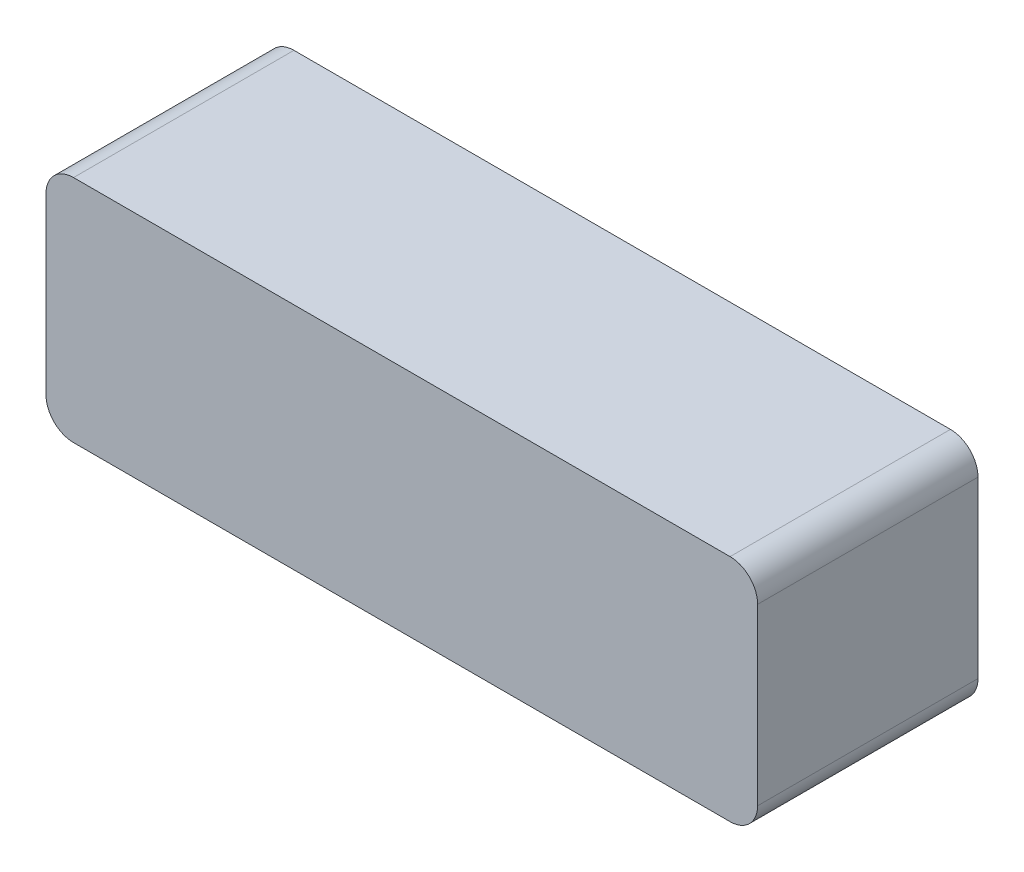
ISO-10303-21;
HEADER;
FILE_DESCRIPTION(('STEP AP214'),'2;1');
FILE_NAME('part.step','',(''),(''),'','','');
FILE_SCHEMA(('AUTOMOTIVE_DESIGN { 1 0 10303 214 1 1 1 1 }'));
ENDSEC;
DATA;
#1=APPLICATION_CONTEXT('core data for automotive mechanical design processes');
#2=APPLICATION_PROTOCOL_DEFINITION('international standard','automotive_design',2000,#1);
#3=PRODUCT_CONTEXT('',#1,'mechanical');
#4=PRODUCT('Part','Part','',(#3));
#5=PRODUCT_RELATED_PRODUCT_CATEGORY('part','',(#4));
#6=PRODUCT_DEFINITION_FORMATION('','',#4);
#7=PRODUCT_DEFINITION_CONTEXT('part definition',#1,'design');
#8=PRODUCT_DEFINITION('design','',#6,#7);
#9=PRODUCT_DEFINITION_SHAPE('','',#8);
#10=(LENGTH_UNIT() NAMED_UNIT(*) SI_UNIT(.MILLI.,.METRE.));
#11=(NAMED_UNIT(*) PLANE_ANGLE_UNIT() SI_UNIT($,.RADIAN.));
#12=(NAMED_UNIT(*) SI_UNIT($,.STERADIAN.) SOLID_ANGLE_UNIT());
#13=UNCERTAINTY_MEASURE_WITH_UNIT(LENGTH_MEASURE(1.E-05),#10,'distance_accuracy_value','');
#14=(GEOMETRIC_REPRESENTATION_CONTEXT(3) GLOBAL_UNCERTAINTY_ASSIGNED_CONTEXT((#13)) GLOBAL_UNIT_ASSIGNED_CONTEXT((#10,
#11,#12)) REPRESENTATION_CONTEXT('',''));
#15=CARTESIAN_POINT('',(0.,0.,0.));
#16=DIRECTION('',(0.,0.,1.));
#17=DIRECTION('',(1.,0.,0.));
#18=AXIS2_PLACEMENT_3D('',#15,#16,#17);
#19=CARTESIAN_POINT('',(-71.5,-19.,24.));
#20=DIRECTION('',(0.,0.,-1.));
#21=DIRECTION('',(-1.,0.,0.));
#22=AXIS2_PLACEMENT_3D('',#19,#20,#21);
#23=CYLINDRICAL_SURFACE('',#22,6.);
#24=CARTESIAN_POINT('',(-71.5,-19.,-24.));
#25=DIRECTION('',(0.,0.,1.));
#26=DIRECTION('',(1.,0.,0.));
#27=AXIS2_PLACEMENT_3D('',#24,#25,#26);
#28=CIRCLE('',#27,6.);
#29=CARTESIAN_POINT('',(-77.5,-19.,-24.));
#30=VERTEX_POINT('',#29);
#31=CARTESIAN_POINT('',(-71.5,-25.,-24.));
#32=VERTEX_POINT('',#31);
#33=EDGE_CURVE('E135',#30,#32,#28,.T.);
#34=ORIENTED_EDGE('',*,*,#33,.T.);
#35=DIRECTION('',(0.,0.,-1.));
#36=VECTOR('',#35,1.);
#37=CARTESIAN_POINT('',(-71.5,-25.,24.));
#38=LINE('',#37,#36);
#39=CARTESIAN_POINT('',(-71.5,-25.,24.));
#40=VERTEX_POINT('',#39);
#41=EDGE_CURVE('E11',#40,#32,#38,.T.);
#42=ORIENTED_EDGE('',*,*,#41,.F.);
#43=CARTESIAN_POINT('',(-71.5,-19.,24.));
#44=DIRECTION('',(0.,0.,1.));
#45=DIRECTION('',(1.,0.,0.));
#46=AXIS2_PLACEMENT_3D('',#43,#44,#45);
#47=CIRCLE('',#46,6.);
#48=CARTESIAN_POINT('',(-77.5,-19.,24.));
#49=VERTEX_POINT('',#48);
#50=EDGE_CURVE('E149',#49,#40,#47,.T.);
#51=ORIENTED_EDGE('',*,*,#50,.F.);
#52=DIRECTION('',(0.,0.,-1.));
#53=VECTOR('',#52,1.);
#54=CARTESIAN_POINT('',(-77.5,-19.,24.));
#55=LINE('',#54,#53);
#56=EDGE_CURVE('E131',#49,#30,#55,.T.);
#57=ORIENTED_EDGE('',*,*,#56,.T.);
#58=EDGE_LOOP('',(#34,#42,#51,#57));
#59=FACE_BOUND('',#58,.T.);
#60=ADVANCED_FACE('F39',(#59),#23,.T.);
#61=CARTESIAN_POINT('',(-71.5,-25.,24.));
#62=DIRECTION('',(0.,1.,0.));
#63=DIRECTION('',(0.,0.,1.));
#64=AXIS2_PLACEMENT_3D('',#61,#62,#63);
#65=PLANE('',#64);
#66=DIRECTION('',(1.,0.,0.));
#67=VECTOR('',#66,1.);
#68=CARTESIAN_POINT('',(-71.5,-25.,-24.));
#69=LINE('',#68,#67);
#70=CARTESIAN_POINT('',(71.5,-25.,-24.));
#71=VERTEX_POINT('',#70);
#72=EDGE_CURVE('E138',#32,#71,#69,.T.);
#73=ORIENTED_EDGE('',*,*,#72,.T.);
#74=DIRECTION('',(0.,0.,-1.));
#75=VECTOR('',#74,1.);
#76=CARTESIAN_POINT('',(71.5,-25.,24.));
#77=LINE('',#76,#75);
#78=CARTESIAN_POINT('',(71.5,-25.,24.));
#79=VERTEX_POINT('',#78);
#80=EDGE_CURVE('E47',#79,#71,#77,.T.);
#81=ORIENTED_EDGE('',*,*,#80,.F.);
#82=DIRECTION('',(1.,0.,0.));
#83=VECTOR('',#82,1.);
#84=CARTESIAN_POINT('',(-71.5,-25.,24.));
#85=LINE('',#84,#83);
#86=EDGE_CURVE('E98',#40,#79,#85,.T.);
#87=ORIENTED_EDGE('',*,*,#86,.F.);
#88=ORIENTED_EDGE('',*,*,#41,.T.);
#89=EDGE_LOOP('',(#73,#81,#87,#88));
#90=FACE_BOUND('',#89,.T.);
#91=ADVANCED_FACE('F184',(#90),#65,.F.);
#92=CARTESIAN_POINT('',(71.5,-19.,24.));
#93=DIRECTION('',(0.,0.,-1.));
#94=DIRECTION('',(-1.,0.,0.));
#95=AXIS2_PLACEMENT_3D('',#92,#93,#94);
#96=CYLINDRICAL_SURFACE('',#95,6.);
#97=CARTESIAN_POINT('',(71.5,-19.,-24.));
#98=DIRECTION('',(0.,0.,1.));
#99=DIRECTION('',(1.,0.,0.));
#100=AXIS2_PLACEMENT_3D('',#97,#98,#99);
#101=CIRCLE('',#100,6.);
#102=CARTESIAN_POINT('',(77.5,-19.,-24.));
#103=VERTEX_POINT('',#102);
#104=EDGE_CURVE('E140',#71,#103,#101,.T.);
#105=ORIENTED_EDGE('',*,*,#104,.T.);
#106=DIRECTION('',(0.,0.,-1.));
#107=VECTOR('',#106,1.);
#108=CARTESIAN_POINT('',(77.5,-19.,24.));
#109=LINE('',#108,#107);
#110=CARTESIAN_POINT('',(77.5,-19.,24.));
#111=VERTEX_POINT('',#110);
#112=EDGE_CURVE('E156',#111,#103,#109,.T.);
#113=ORIENTED_EDGE('',*,*,#112,.F.);
#114=CARTESIAN_POINT('',(71.5,-19.,24.));
#115=DIRECTION('',(0.,0.,1.));
#116=DIRECTION('',(1.,0.,0.));
#117=AXIS2_PLACEMENT_3D('',#114,#115,#116);
#118=CIRCLE('',#117,6.);
#119=EDGE_CURVE('E164',#79,#111,#118,.T.);
#120=ORIENTED_EDGE('',*,*,#119,.F.);
#121=ORIENTED_EDGE('',*,*,#80,.T.);
#122=EDGE_LOOP('',(#105,#113,#120,#121));
#123=FACE_BOUND('',#122,.T.);
#124=ADVANCED_FACE('F162',(#123),#96,.T.);
#125=CARTESIAN_POINT('',(77.5,-19.,24.));
#126=DIRECTION('',(-1.,0.,0.));
#127=DIRECTION('',(0.,0.,1.));
#128=AXIS2_PLACEMENT_3D('',#125,#126,#127);
#129=PLANE('',#128);
#130=DIRECTION('',(0.,1.,0.));
#131=VECTOR('',#130,1.);
#132=CARTESIAN_POINT('',(77.5,-19.,-24.));
#133=LINE('',#132,#131);
#134=CARTESIAN_POINT('',(77.5,19.,-24.));
#135=VERTEX_POINT('',#134);
#136=EDGE_CURVE('E142',#103,#135,#133,.T.);
#137=ORIENTED_EDGE('',*,*,#136,.T.);
#138=DIRECTION('',(0.,0.,-1.));
#139=VECTOR('',#138,1.);
#140=CARTESIAN_POINT('',(77.5,19.,24.));
#141=LINE('',#140,#139);
#142=CARTESIAN_POINT('',(77.5,19.,24.));
#143=VERTEX_POINT('',#142);
#144=EDGE_CURVE('E153',#143,#135,#141,.T.);
#145=ORIENTED_EDGE('',*,*,#144,.F.);
#146=DIRECTION('',(0.,1.,0.));
#147=VECTOR('',#146,1.);
#148=CARTESIAN_POINT('',(77.5,-19.,24.));
#149=LINE('',#148,#147);
#150=EDGE_CURVE('E176',#111,#143,#149,.T.);
#151=ORIENTED_EDGE('',*,*,#150,.F.);
#152=ORIENTED_EDGE('',*,*,#112,.T.);
#153=EDGE_LOOP('',(#137,#145,#151,#152));
#154=FACE_BOUND('',#153,.T.);
#155=ADVANCED_FACE('F172',(#154),#129,.F.);
#156=CARTESIAN_POINT('',(71.5,19.,24.));
#157=DIRECTION('',(0.,0.,-1.));
#158=DIRECTION('',(-1.,0.,0.));
#159=AXIS2_PLACEMENT_3D('',#156,#157,#158);
#160=CYLINDRICAL_SURFACE('',#159,6.);
#161=CARTESIAN_POINT('',(71.5,19.,-24.));
#162=DIRECTION('',(0.,0.,1.));
#163=DIRECTION('',(1.,0.,0.));
#164=AXIS2_PLACEMENT_3D('',#161,#162,#163);
#165=CIRCLE('',#164,6.);
#166=CARTESIAN_POINT('',(71.5,25.,-24.));
#167=VERTEX_POINT('',#166);
#168=EDGE_CURVE('E144',#135,#167,#165,.T.);
#169=ORIENTED_EDGE('',*,*,#168,.T.);
#170=DIRECTION('',(0.,0.,-1.));
#171=VECTOR('',#170,1.);
#172=CARTESIAN_POINT('',(71.5,25.,24.));
#173=LINE('',#172,#171);
#174=CARTESIAN_POINT('',(71.5,25.,24.));
#175=VERTEX_POINT('',#174);
#176=EDGE_CURVE('E126',#175,#167,#173,.T.);
#177=ORIENTED_EDGE('',*,*,#176,.F.);
#178=CARTESIAN_POINT('',(71.5,19.,24.));
#179=DIRECTION('',(0.,0.,1.));
#180=DIRECTION('',(1.,0.,0.));
#181=AXIS2_PLACEMENT_3D('',#178,#179,#180);
#182=CIRCLE('',#181,6.);
#183=EDGE_CURVE('E117',#143,#175,#182,.T.);
#184=ORIENTED_EDGE('',*,*,#183,.F.);
#185=ORIENTED_EDGE('',*,*,#144,.T.);
#186=EDGE_LOOP('',(#169,#177,#184,#185));
#187=FACE_BOUND('',#186,.T.);
#188=ADVANCED_FACE('F175',(#187),#160,.T.);
#189=CARTESIAN_POINT('',(71.5,25.,24.));
#190=DIRECTION('',(0.,-1.,0.));
#191=DIRECTION('',(0.,0.,-1.));
#192=AXIS2_PLACEMENT_3D('',#189,#190,#191);
#193=PLANE('',#192);
#194=DIRECTION('',(-1.,0.,0.));
#195=VECTOR('',#194,1.);
#196=CARTESIAN_POINT('',(71.5,25.,-24.));
#197=LINE('',#196,#195);
#198=CARTESIAN_POINT('',(-71.5,25.,-24.));
#199=VERTEX_POINT('',#198);
#200=EDGE_CURVE('E125',#167,#199,#197,.T.);
#201=ORIENTED_EDGE('',*,*,#200,.T.);
#202=DIRECTION('',(0.,0.,-1.));
#203=VECTOR('',#202,1.);
#204=CARTESIAN_POINT('',(-71.5,25.,24.));
#205=LINE('',#204,#203);
#206=CARTESIAN_POINT('',(-71.5,25.,24.));
#207=VERTEX_POINT('',#206);
#208=EDGE_CURVE('E122',#207,#199,#205,.T.);
#209=ORIENTED_EDGE('',*,*,#208,.F.);
#210=DIRECTION('',(-1.,0.,0.));
#211=VECTOR('',#210,1.);
#212=CARTESIAN_POINT('',(71.5,25.,24.));
#213=LINE('',#212,#211);
#214=EDGE_CURVE('E111',#175,#207,#213,.T.);
#215=ORIENTED_EDGE('',*,*,#214,.F.);
#216=ORIENTED_EDGE('',*,*,#176,.T.);
#217=EDGE_LOOP('',(#201,#209,#215,#216));
#218=FACE_BOUND('',#217,.T.);
#219=ADVANCED_FACE('F123',(#218),#193,.F.);
#220=CARTESIAN_POINT('',(-71.5,19.,24.));
#221=DIRECTION('',(0.,0.,-1.));
#222=DIRECTION('',(-1.,0.,0.));
#223=AXIS2_PLACEMENT_3D('',#220,#221,#222);
#224=CYLINDRICAL_SURFACE('',#223,6.);
#225=CARTESIAN_POINT('',(-71.5,19.,-24.));
#226=DIRECTION('',(0.,0.,1.));
#227=DIRECTION('',(1.,0.,0.));
#228=AXIS2_PLACEMENT_3D('',#225,#226,#227);
#229=CIRCLE('',#228,6.);
#230=CARTESIAN_POINT('',(-77.5,19.,-24.));
#231=VERTEX_POINT('',#230);
#232=EDGE_CURVE('E84',#199,#231,#229,.T.);
#233=ORIENTED_EDGE('',*,*,#232,.T.);
#234=DIRECTION('',(0.,0.,-1.));
#235=VECTOR('',#234,1.);
#236=CARTESIAN_POINT('',(-77.5,19.,24.));
#237=LINE('',#236,#235);
#238=CARTESIAN_POINT('',(-77.5,19.,24.));
#239=VERTEX_POINT('',#238);
#240=EDGE_CURVE('E127',#239,#231,#237,.T.);
#241=ORIENTED_EDGE('',*,*,#240,.F.);
#242=CARTESIAN_POINT('',(-71.5,19.,24.));
#243=DIRECTION('',(0.,0.,1.));
#244=DIRECTION('',(1.,0.,0.));
#245=AXIS2_PLACEMENT_3D('',#242,#243,#244);
#246=CIRCLE('',#245,6.);
#247=EDGE_CURVE('E115',#207,#239,#246,.T.);
#248=ORIENTED_EDGE('',*,*,#247,.F.);
#249=ORIENTED_EDGE('',*,*,#208,.T.);
#250=EDGE_LOOP('',(#233,#241,#248,#249));
#251=FACE_BOUND('',#250,.T.);
#252=ADVANCED_FACE('F129',(#251),#224,.T.);
#253=CARTESIAN_POINT('',(-77.5,19.,24.));
#254=DIRECTION('',(1.,0.,0.));
#255=DIRECTION('',(0.,0.,-1.));
#256=AXIS2_PLACEMENT_3D('',#253,#254,#255);
#257=PLANE('',#256);
#258=DIRECTION('',(0.,-1.,0.));
#259=VECTOR('',#258,1.);
#260=CARTESIAN_POINT('',(-77.5,19.,-24.));
#261=LINE('',#260,#259);
#262=EDGE_CURVE('E90',#231,#30,#261,.T.);
#263=ORIENTED_EDGE('',*,*,#262,.T.);
#264=ORIENTED_EDGE('',*,*,#56,.F.);
#265=DIRECTION('',(0.,-1.,0.));
#266=VECTOR('',#265,1.);
#267=CARTESIAN_POINT('',(-77.5,19.,24.));
#268=LINE('',#267,#266);
#269=EDGE_CURVE('E55',#239,#49,#268,.T.);
#270=ORIENTED_EDGE('',*,*,#269,.F.);
#271=ORIENTED_EDGE('',*,*,#240,.T.);
#272=EDGE_LOOP('',(#263,#264,#270,#271));
#273=FACE_BOUND('',#272,.T.);
#274=ADVANCED_FACE('F200',(#273),#257,.F.);
#275=CARTESIAN_POINT('',(-71.5,-19.,24.));
#276=DIRECTION('',(0.,0.,1.));
#277=DIRECTION('',(1.,0.,0.));
#278=AXIS2_PLACEMENT_3D('',#275,#276,#277);
#279=PLANE('',#278);
#280=ORIENTED_EDGE('',*,*,#50,.T.);
#281=ORIENTED_EDGE('',*,*,#86,.T.);
#282=ORIENTED_EDGE('',*,*,#119,.T.);
#283=ORIENTED_EDGE('',*,*,#150,.T.);
#284=ORIENTED_EDGE('',*,*,#183,.T.);
#285=ORIENTED_EDGE('',*,*,#214,.T.);
#286=ORIENTED_EDGE('',*,*,#247,.T.);
#287=ORIENTED_EDGE('',*,*,#269,.T.);
#288=EDGE_LOOP('',(#280,#281,#282,#283,#284,#285,#286,#287));
#289=FACE_BOUND('',#288,.T.);
#290=ADVANCED_FACE('F113',(#289),#279,.T.);
#291=CARTESIAN_POINT('',(-71.5,-19.,-24.));
#292=DIRECTION('',(0.,0.,1.));
#293=DIRECTION('',(1.,0.,0.));
#294=AXIS2_PLACEMENT_3D('',#291,#292,#293);
#295=PLANE('',#294);
#296=ORIENTED_EDGE('',*,*,#33,.F.);
#297=ORIENTED_EDGE('',*,*,#262,.F.);
#298=ORIENTED_EDGE('',*,*,#232,.F.);
#299=ORIENTED_EDGE('',*,*,#200,.F.);
#300=ORIENTED_EDGE('',*,*,#168,.F.);
#301=ORIENTED_EDGE('',*,*,#136,.F.);
#302=ORIENTED_EDGE('',*,*,#104,.F.);
#303=ORIENTED_EDGE('',*,*,#72,.F.);
#304=EDGE_LOOP('',(#296,#297,#298,#299,#300,#301,#302,#303));
#305=FACE_BOUND('',#304,.T.);
#306=ADVANCED_FACE('F168',(#305),#295,.F.);
#307=CLOSED_SHELL('',(#60,#91,#124,#155,#188,#219,#252,#274,#290,#306));
#308=MANIFOLD_SOLID_BREP('B2',#307);
#309=ADVANCED_BREP_SHAPE_REPRESENTATION('',(#18,#308),#14);
#310=SHAPE_DEFINITION_REPRESENTATION(#9,#309);
ENDSEC;
END-ISO-10303-21;
